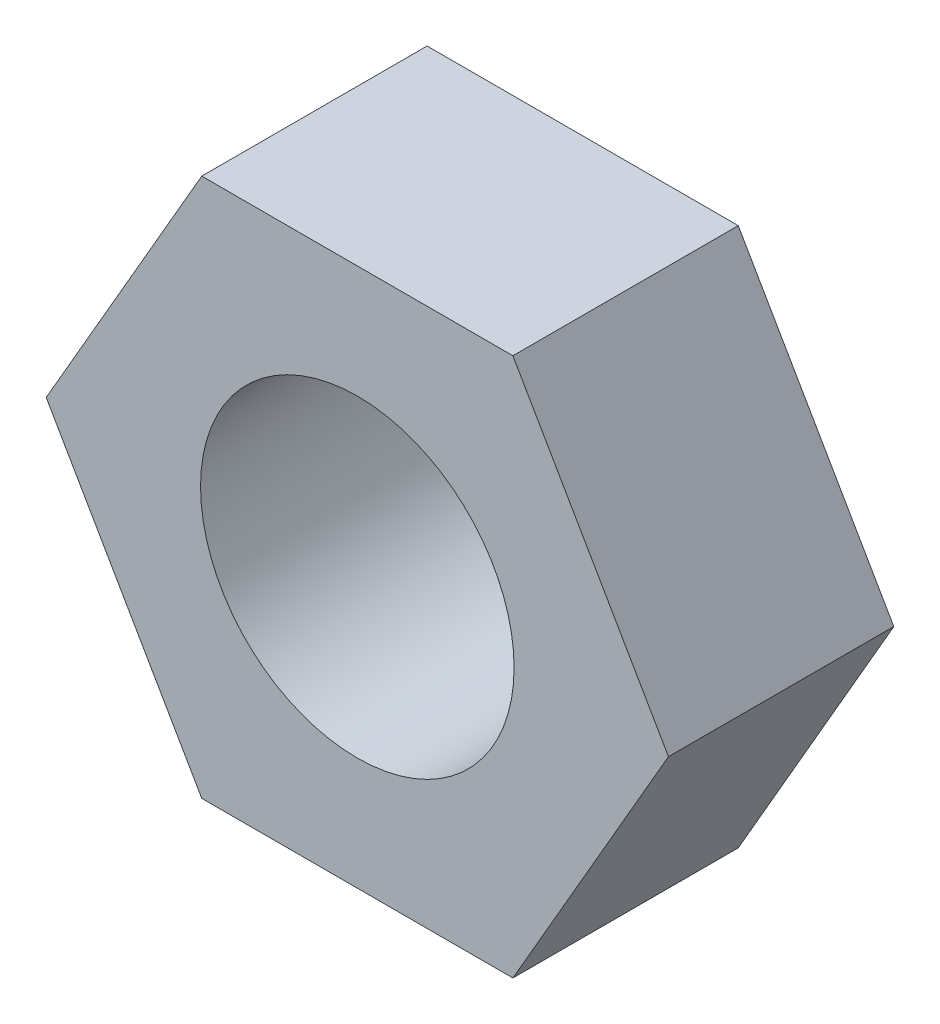
ISO-10303-21;
HEADER;
FILE_DESCRIPTION(('STEP AP214'),'2;1');
FILE_NAME('part.step','',(''),(''),'','','');
FILE_SCHEMA(('AUTOMOTIVE_DESIGN { 1 0 10303 214 1 1 1 1 }'));
ENDSEC;
DATA;
#1=APPLICATION_CONTEXT('core data for automotive mechanical design processes');
#2=APPLICATION_PROTOCOL_DEFINITION('international standard','automotive_design',2000,#1);
#3=PRODUCT_CONTEXT('',#1,'mechanical');
#4=PRODUCT('Part','Part','',(#3));
#5=PRODUCT_RELATED_PRODUCT_CATEGORY('part','',(#4));
#6=PRODUCT_DEFINITION_FORMATION('','',#4);
#7=PRODUCT_DEFINITION_CONTEXT('part definition',#1,'design');
#8=PRODUCT_DEFINITION('design','',#6,#7);
#9=PRODUCT_DEFINITION_SHAPE('','',#8);
#10=(LENGTH_UNIT() NAMED_UNIT(*) SI_UNIT(.MILLI.,.METRE.));
#11=(NAMED_UNIT(*) PLANE_ANGLE_UNIT() SI_UNIT($,.RADIAN.));
#12=(NAMED_UNIT(*) SI_UNIT($,.STERADIAN.) SOLID_ANGLE_UNIT());
#13=UNCERTAINTY_MEASURE_WITH_UNIT(LENGTH_MEASURE(1.E-05),#10,'distance_accuracy_value','');
#14=(GEOMETRIC_REPRESENTATION_CONTEXT(3) GLOBAL_UNCERTAINTY_ASSIGNED_CONTEXT((#13)) GLOBAL_UNIT_ASSIGNED_CONTEXT((#10,
#11,#12)) REPRESENTATION_CONTEXT('',''));
#15=CARTESIAN_POINT('',(0.,0.,0.));
#16=DIRECTION('',(0.,0.,1.));
#17=DIRECTION('',(1.,0.,0.));
#18=AXIS2_PLACEMENT_3D('',#15,#16,#17);
#19=CARTESIAN_POINT('',(0.,0.,2.3));
#20=DIRECTION('',(0.,0.,1.));
#21=DIRECTION('',(1.,0.,0.));
#22=AXIS2_PLACEMENT_3D('',#19,#20,#21);
#23=PLANE('',#22);
#24=DIRECTION('',(-0.5,0.866025403784439,0.));
#25=VECTOR('',#24,1.);
#26=CARTESIAN_POINT('',(3.17542648054294,0.,2.3));
#27=LINE('',#26,#25);
#28=CARTESIAN_POINT('',(3.17542648054294,0.,2.3));
#29=VERTEX_POINT('',#28);
#30=CARTESIAN_POINT('',(1.58771324027147,2.75,2.3));
#31=VERTEX_POINT('',#30);
#32=EDGE_CURVE('E130',#29,#31,#27,.T.);
#33=ORIENTED_EDGE('',*,*,#32,.T.);
#34=DIRECTION('',(-1.,0.,0.));
#35=VECTOR('',#34,1.);
#36=CARTESIAN_POINT('',(1.58771324027147,2.75,2.3));
#37=LINE('',#36,#35);
#38=CARTESIAN_POINT('',(-1.58771324027147,2.75,2.3));
#39=VERTEX_POINT('',#38);
#40=EDGE_CURVE('E88',#31,#39,#37,.T.);
#41=ORIENTED_EDGE('',*,*,#40,.T.);
#42=DIRECTION('',(-0.5,-0.866025403784439,0.));
#43=VECTOR('',#42,1.);
#44=CARTESIAN_POINT('',(-1.58771324027147,2.75,2.3));
#45=LINE('',#44,#43);
#46=CARTESIAN_POINT('',(-3.17542648054294,0.,2.3));
#47=VERTEX_POINT('',#46);
#48=EDGE_CURVE('E101',#39,#47,#45,.T.);
#49=ORIENTED_EDGE('',*,*,#48,.T.);
#50=DIRECTION('',(0.5,-0.866025403784439,0.));
#51=VECTOR('',#50,1.);
#52=CARTESIAN_POINT('',(-3.17542648054294,0.,2.3));
#53=LINE('',#52,#51);
#54=CARTESIAN_POINT('',(-1.58771324027147,-2.75,2.3));
#55=VERTEX_POINT('',#54);
#56=EDGE_CURVE('E95',#47,#55,#53,.T.);
#57=ORIENTED_EDGE('',*,*,#56,.T.);
#58=DIRECTION('',(1.,0.,0.));
#59=VECTOR('',#58,1.);
#60=CARTESIAN_POINT('',(-1.58771324027147,-2.75,2.3));
#61=LINE('',#60,#59);
#62=CARTESIAN_POINT('',(1.58771324027147,-2.75,2.3));
#63=VERTEX_POINT('',#62);
#64=EDGE_CURVE('E99',#55,#63,#61,.T.);
#65=ORIENTED_EDGE('',*,*,#64,.T.);
#66=DIRECTION('',(0.5,0.866025403784439,0.));
#67=VECTOR('',#66,1.);
#68=CARTESIAN_POINT('',(1.58771324027147,-2.75,2.3));
#69=LINE('',#68,#67);
#70=EDGE_CURVE('E51',#63,#29,#69,.T.);
#71=ORIENTED_EDGE('',*,*,#70,.T.);
#72=EDGE_LOOP('',(#33,#41,#49,#57,#65,#71));
#73=FACE_BOUND('',#72,.T.);
#74=CARTESIAN_POINT('',(0.,0.,2.3));
#75=DIRECTION('',(0.,0.,1.));
#76=DIRECTION('',(1.,0.,0.));
#77=AXIS2_PLACEMENT_3D('',#74,#75,#76);
#78=CIRCLE('',#77,1.6);
#79=CARTESIAN_POINT('',(1.6,0.,2.3));
#80=VERTEX_POINT('',#79);
#81=EDGE_CURVE('E123',#80,#80,#78,.T.);
#82=ORIENTED_EDGE('',*,*,#81,.F.);
#83=EDGE_LOOP('',(#82));
#84=FACE_BOUND('',#83,.T.);
#85=ADVANCED_FACE('F34',(#73,#84),#23,.T.);
#86=CARTESIAN_POINT('',(0.,0.,0.));
#87=DIRECTION('',(0.,0.,1.));
#88=DIRECTION('',(1.,0.,0.));
#89=AXIS2_PLACEMENT_3D('',#86,#87,#88);
#90=PLANE('',#89);
#91=DIRECTION('',(-0.5,0.866025403784439,0.));
#92=VECTOR('',#91,1.);
#93=CARTESIAN_POINT('',(3.17542648054294,0.,0.));
#94=LINE('',#93,#92);
#95=CARTESIAN_POINT('',(3.17542648054294,0.,0.));
#96=VERTEX_POINT('',#95);
#97=CARTESIAN_POINT('',(1.58771324027147,2.75,0.));
#98=VERTEX_POINT('',#97);
#99=EDGE_CURVE('E119',#96,#98,#94,.T.);
#100=ORIENTED_EDGE('',*,*,#99,.F.);
#101=DIRECTION('',(0.5,0.866025403784439,0.));
#102=VECTOR('',#101,1.);
#103=CARTESIAN_POINT('',(1.58771324027147,-2.75,0.));
#104=LINE('',#103,#102);
#105=CARTESIAN_POINT('',(1.58771324027147,-2.75,0.));
#106=VERTEX_POINT('',#105);
#107=EDGE_CURVE('E80',#106,#96,#104,.T.);
#108=ORIENTED_EDGE('',*,*,#107,.F.);
#109=DIRECTION('',(1.,0.,0.));
#110=VECTOR('',#109,1.);
#111=CARTESIAN_POINT('',(-1.58771324027147,-2.75,0.));
#112=LINE('',#111,#110);
#113=CARTESIAN_POINT('',(-1.58771324027147,-2.75,0.));
#114=VERTEX_POINT('',#113);
#115=EDGE_CURVE('E74',#114,#106,#112,.T.);
#116=ORIENTED_EDGE('',*,*,#115,.F.);
#117=DIRECTION('',(0.5,-0.866025403784439,0.));
#118=VECTOR('',#117,1.);
#119=CARTESIAN_POINT('',(-3.17542648054294,0.,0.));
#120=LINE('',#119,#118);
#121=CARTESIAN_POINT('',(-3.17542648054294,0.,0.));
#122=VERTEX_POINT('',#121);
#123=EDGE_CURVE('E109',#122,#114,#120,.T.);
#124=ORIENTED_EDGE('',*,*,#123,.F.);
#125=DIRECTION('',(-0.5,-0.866025403784439,0.));
#126=VECTOR('',#125,1.);
#127=CARTESIAN_POINT('',(-1.58771324027147,2.75,0.));
#128=LINE('',#127,#126);
#129=CARTESIAN_POINT('',(-1.58771324027147,2.75,0.));
#130=VERTEX_POINT('',#129);
#131=EDGE_CURVE('E125',#130,#122,#128,.T.);
#132=ORIENTED_EDGE('',*,*,#131,.F.);
#133=DIRECTION('',(-1.,0.,0.));
#134=VECTOR('',#133,1.);
#135=CARTESIAN_POINT('',(1.58771324027147,2.75,0.));
#136=LINE('',#135,#134);
#137=EDGE_CURVE('E122',#98,#130,#136,.T.);
#138=ORIENTED_EDGE('',*,*,#137,.F.);
#139=EDGE_LOOP('',(#100,#108,#116,#124,#132,#138));
#140=FACE_BOUND('',#139,.T.);
#141=CARTESIAN_POINT('',(0.,0.,0.));
#142=DIRECTION('',(0.,0.,1.));
#143=DIRECTION('',(1.,0.,0.));
#144=AXIS2_PLACEMENT_3D('',#141,#142,#143);
#145=CIRCLE('',#144,1.6);
#146=CARTESIAN_POINT('',(1.6,0.,0.));
#147=VERTEX_POINT('',#146);
#148=EDGE_CURVE('E223',#147,#147,#145,.T.);
#149=ORIENTED_EDGE('',*,*,#148,.T.);
#150=EDGE_LOOP('',(#149));
#151=FACE_BOUND('',#150,.T.);
#152=ADVANCED_FACE('F139',(#140,#151),#90,.F.);
#153=CARTESIAN_POINT('',(3.17542648054294,0.,2.3));
#154=DIRECTION('',(-0.866025403784439,-0.5,0.));
#155=DIRECTION('',(0.5,-0.866025403784439,0.));
#156=AXIS2_PLACEMENT_3D('',#153,#154,#155);
#157=PLANE('',#156);
#158=ORIENTED_EDGE('',*,*,#99,.T.);
#159=DIRECTION('',(0.,0.,-1.));
#160=VECTOR('',#159,1.);
#161=CARTESIAN_POINT('',(1.58771324027147,2.75,2.3));
#162=LINE('',#161,#160);
#163=EDGE_CURVE('E11',#31,#98,#162,.T.);
#164=ORIENTED_EDGE('',*,*,#163,.F.);
#165=ORIENTED_EDGE('',*,*,#32,.F.);
#166=DIRECTION('',(0.,0.,-1.));
#167=VECTOR('',#166,1.);
#168=CARTESIAN_POINT('',(3.17542648054294,0.,2.3));
#169=LINE('',#168,#167);
#170=EDGE_CURVE('E115',#29,#96,#169,.T.);
#171=ORIENTED_EDGE('',*,*,#170,.T.);
#172=EDGE_LOOP('',(#158,#164,#165,#171));
#173=FACE_BOUND('',#172,.T.);
#174=ADVANCED_FACE('F36',(#173),#157,.F.);
#175=CARTESIAN_POINT('',(1.58771324027147,2.75,2.3));
#176=DIRECTION('',(0.,-1.,0.));
#177=DIRECTION('',(0.,0.,-1.));
#178=AXIS2_PLACEMENT_3D('',#175,#176,#177);
#179=PLANE('',#178);
#180=ORIENTED_EDGE('',*,*,#137,.T.);
#181=DIRECTION('',(0.,0.,-1.));
#182=VECTOR('',#181,1.);
#183=CARTESIAN_POINT('',(-1.58771324027147,2.75,2.3));
#184=LINE('',#183,#182);
#185=EDGE_CURVE('E43',#39,#130,#184,.T.);
#186=ORIENTED_EDGE('',*,*,#185,.F.);
#187=ORIENTED_EDGE('',*,*,#40,.F.);
#188=ORIENTED_EDGE('',*,*,#163,.T.);
#189=EDGE_LOOP('',(#180,#186,#187,#188));
#190=FACE_BOUND('',#189,.T.);
#191=ADVANCED_FACE('F164',(#190),#179,.F.);
#192=CARTESIAN_POINT('',(-1.58771324027147,2.75,2.3));
#193=DIRECTION('',(0.866025403784439,-0.5,0.));
#194=DIRECTION('',(0.5,0.866025403784439,0.));
#195=AXIS2_PLACEMENT_3D('',#192,#193,#194);
#196=PLANE('',#195);
#197=ORIENTED_EDGE('',*,*,#131,.T.);
#198=DIRECTION('',(0.,0.,-1.));
#199=VECTOR('',#198,1.);
#200=CARTESIAN_POINT('',(-3.17542648054294,0.,2.3));
#201=LINE('',#200,#199);
#202=EDGE_CURVE('E110',#47,#122,#201,.T.);
#203=ORIENTED_EDGE('',*,*,#202,.F.);
#204=ORIENTED_EDGE('',*,*,#48,.F.);
#205=ORIENTED_EDGE('',*,*,#185,.T.);
#206=EDGE_LOOP('',(#197,#203,#204,#205));
#207=FACE_BOUND('',#206,.T.);
#208=ADVANCED_FACE('F136',(#207),#196,.F.);
#209=CARTESIAN_POINT('',(-3.17542648054294,0.,2.3));
#210=DIRECTION('',(0.866025403784439,0.5,0.));
#211=DIRECTION('',(-0.5,0.866025403784439,0.));
#212=AXIS2_PLACEMENT_3D('',#209,#210,#211);
#213=PLANE('',#212);
#214=ORIENTED_EDGE('',*,*,#123,.T.);
#215=DIRECTION('',(0.,0.,-1.));
#216=VECTOR('',#215,1.);
#217=CARTESIAN_POINT('',(-1.58771324027147,-2.75,2.3));
#218=LINE('',#217,#216);
#219=EDGE_CURVE('E106',#55,#114,#218,.T.);
#220=ORIENTED_EDGE('',*,*,#219,.F.);
#221=ORIENTED_EDGE('',*,*,#56,.F.);
#222=ORIENTED_EDGE('',*,*,#202,.T.);
#223=EDGE_LOOP('',(#214,#220,#221,#222));
#224=FACE_BOUND('',#223,.T.);
#225=ADVANCED_FACE('F107',(#224),#213,.F.);
#226=CARTESIAN_POINT('',(-1.58771324027147,-2.75,2.3));
#227=DIRECTION('',(0.,1.,0.));
#228=DIRECTION('',(0.,0.,1.));
#229=AXIS2_PLACEMENT_3D('',#226,#227,#228);
#230=PLANE('',#229);
#231=ORIENTED_EDGE('',*,*,#115,.T.);
#232=DIRECTION('',(0.,0.,-1.));
#233=VECTOR('',#232,1.);
#234=CARTESIAN_POINT('',(1.58771324027147,-2.75,2.3));
#235=LINE('',#234,#233);
#236=EDGE_CURVE('E111',#63,#106,#235,.T.);
#237=ORIENTED_EDGE('',*,*,#236,.F.);
#238=ORIENTED_EDGE('',*,*,#64,.F.);
#239=ORIENTED_EDGE('',*,*,#219,.T.);
#240=EDGE_LOOP('',(#231,#237,#238,#239));
#241=FACE_BOUND('',#240,.T.);
#242=ADVANCED_FACE('F113',(#241),#230,.F.);
#243=CARTESIAN_POINT('',(1.58771324027147,-2.75,2.3));
#244=DIRECTION('',(-0.866025403784439,0.5,0.));
#245=DIRECTION('',(-0.5,-0.866025403784439,0.));
#246=AXIS2_PLACEMENT_3D('',#243,#244,#245);
#247=PLANE('',#246);
#248=ORIENTED_EDGE('',*,*,#107,.T.);
#249=ORIENTED_EDGE('',*,*,#170,.F.);
#250=ORIENTED_EDGE('',*,*,#70,.F.);
#251=ORIENTED_EDGE('',*,*,#236,.T.);
#252=EDGE_LOOP('',(#248,#249,#250,#251));
#253=FACE_BOUND('',#252,.T.);
#254=ADVANCED_FACE('F144',(#253),#247,.F.);
#255=CARTESIAN_POINT('',(0.,0.,2.3));
#256=DIRECTION('',(0.,0.,-1.));
#257=DIRECTION('',(-1.,0.,0.));
#258=AXIS2_PLACEMENT_3D('',#255,#256,#257);
#259=CYLINDRICAL_SURFACE('',#258,1.6);
#260=ORIENTED_EDGE('',*,*,#81,.T.);
#261=EDGE_LOOP('',(#260));
#262=FACE_BOUND('',#261,.T.);
#263=ORIENTED_EDGE('',*,*,#148,.F.);
#264=EDGE_LOOP('',(#263));
#265=FACE_BOUND('',#264,.T.);
#266=ADVANCED_FACE('F146',(#262,#265),#259,.F.);
#267=CLOSED_SHELL('',(#85,#152,#174,#191,#208,#225,#242,#254,#266));
#268=MANIFOLD_SOLID_BREP('B2',#267);
#269=ADVANCED_BREP_SHAPE_REPRESENTATION('',(#18,#268),#14);
#270=SHAPE_DEFINITION_REPRESENTATION(#9,#269);
ENDSEC;
END-ISO-10303-21;
